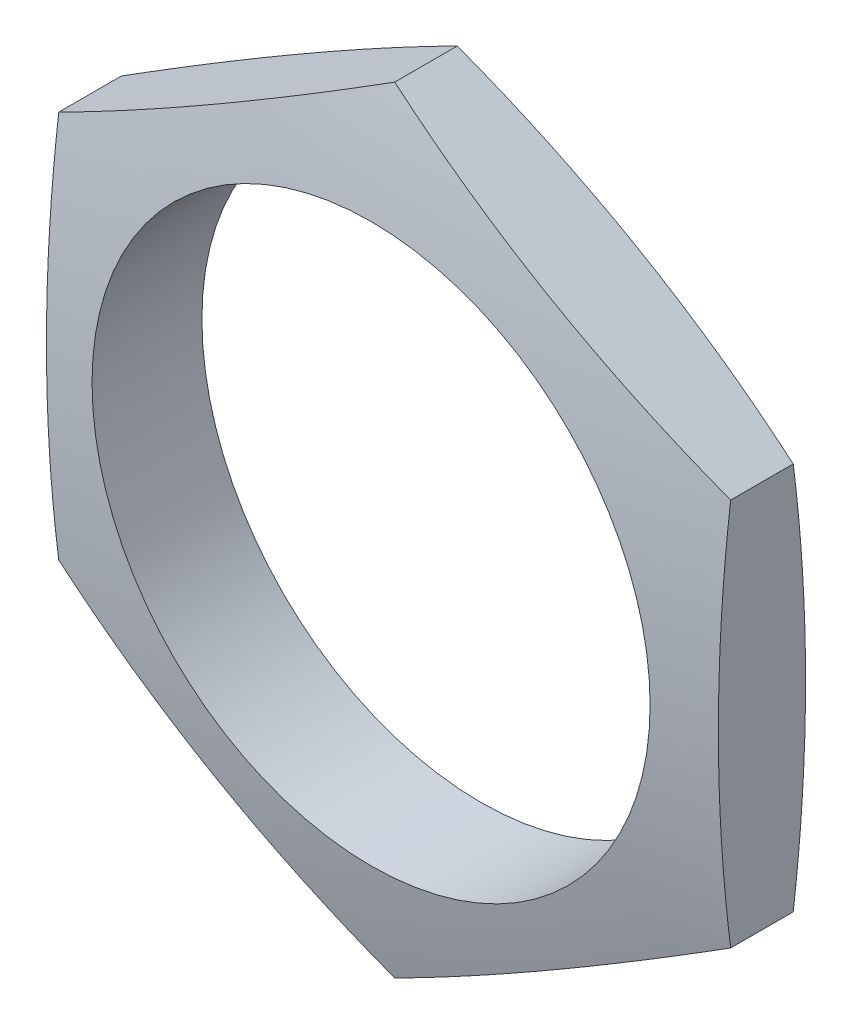
ISO-10303-21;
HEADER;
FILE_DESCRIPTION(('STEP AP214'),'2;1');
FILE_NAME('part.step','',(''),(''),'','','');
FILE_SCHEMA(('AUTOMOTIVE_DESIGN { 1 0 10303 214 1 1 1 1 }'));
ENDSEC;
DATA;
#1=APPLICATION_CONTEXT('core data for automotive mechanical design processes');
#2=APPLICATION_PROTOCOL_DEFINITION('international standard','automotive_design',2000,#1);
#3=PRODUCT_CONTEXT('',#1,'mechanical');
#4=PRODUCT('Part','Part','',(#3));
#5=PRODUCT_RELATED_PRODUCT_CATEGORY('part','',(#4));
#6=PRODUCT_DEFINITION_FORMATION('','',#4);
#7=PRODUCT_DEFINITION_CONTEXT('part definition',#1,'design');
#8=PRODUCT_DEFINITION('design','',#6,#7);
#9=PRODUCT_DEFINITION_SHAPE('','',#8);
#10=(LENGTH_UNIT() NAMED_UNIT(*) SI_UNIT(.MILLI.,.METRE.));
#11=(NAMED_UNIT(*) PLANE_ANGLE_UNIT() SI_UNIT($,.RADIAN.));
#12=(NAMED_UNIT(*) SI_UNIT($,.STERADIAN.) SOLID_ANGLE_UNIT());
#13=UNCERTAINTY_MEASURE_WITH_UNIT(LENGTH_MEASURE(1.E-05),#10,'distance_accuracy_value','');
#14=(GEOMETRIC_REPRESENTATION_CONTEXT(3) GLOBAL_UNCERTAINTY_ASSIGNED_CONTEXT((#13)) GLOBAL_UNIT_ASSIGNED_CONTEXT((#10,
#11,#12)) REPRESENTATION_CONTEXT('',''));
#15=CARTESIAN_POINT('',(0.,0.,0.));
#16=DIRECTION('',(0.,0.,1.));
#17=DIRECTION('',(1.,0.,0.));
#18=AXIS2_PLACEMENT_3D('',#15,#16,#17);
#19=CARTESIAN_POINT('',(6.92820323027546,4.00000000000008,2.8));
#20=DIRECTION('',(-0.499999999999995,-0.866025403784442,0.));
#21=DIRECTION('',(0.866025403784442,-0.499999999999995,0.));
#22=AXIS2_PLACEMENT_3D('',#19,#20,#21);
#23=PLANE('',#22);
#24=CARTESIAN_POINT('',(3.46410161513783,5.99999999999999,32.1649899582307));
#25=DIRECTION('',(-0.499999999999995,-0.866025403784442,0.));
#26=DIRECTION('',(0.866025403784442,-0.499999999999995,0.));
#27=AXIS2_PLACEMENT_3D('',#24,#25,#26);
#28=CIRCLE('',#27,31.6636475948852);
#29=CARTESIAN_POINT('',(1.63253663979982E-11,8.,0.755014170066153));
#30=VERTEX_POINT('',#29);
#31=CARTESIAN_POINT('',(6.92820323027546,4.00000000000008,0.755014170066154));
#32=VERTEX_POINT('',#31);
#33=EDGE_CURVE('E50',#30,#32,#28,.T.);
#34=ORIENTED_EDGE('',*,*,#33,.F.);
#35=DIRECTION('',(0.,0.,-1.));
#36=VECTOR('',#35,1.);
#37=CARTESIAN_POINT('',(0.,8.,2.8));
#38=LINE('',#37,#36);
#39=CARTESIAN_POINT('',(-3.50178666987978E-13,7.9999999999998,2.04498582993385));
#40=VERTEX_POINT('',#39);
#41=EDGE_CURVE('E11',#40,#30,#38,.T.);
#42=ORIENTED_EDGE('',*,*,#41,.F.);
#43=CARTESIAN_POINT('',(3.46410161513783,5.99999999999999,-29.3649899582307));
#44=DIRECTION('',(-0.499999999999995,-0.866025403784442,0.));
#45=DIRECTION('',(0.866025403784442,-0.499999999999995,0.));
#46=AXIS2_PLACEMENT_3D('',#43,#44,#45);
#47=CIRCLE('',#46,31.6636475948852);
#48=CARTESIAN_POINT('',(6.92820323027546,3.99999999999977,2.04498582993385));
#49=VERTEX_POINT('',#48);
#50=EDGE_CURVE('E125',#49,#40,#47,.T.);
#51=ORIENTED_EDGE('',*,*,#50,.F.);
#52=DIRECTION('',(0.,0.,-1.));
#53=VECTOR('',#52,1.);
#54=CARTESIAN_POINT('',(6.92820323027546,4.00000000000008,2.8));
#55=LINE('',#54,#53);
#56=EDGE_CURVE('E127',#49,#32,#55,.T.);
#57=ORIENTED_EDGE('',*,*,#56,.T.);
#58=EDGE_LOOP('',(#34,#42,#51,#57));
#59=FACE_BOUND('',#58,.T.);
#60=ADVANCED_FACE('F34',(#59),#23,.F.);
#61=CARTESIAN_POINT('',(0.,8.,2.8));
#62=DIRECTION('',(0.500000000000001,-0.866025403784438,0.));
#63=DIRECTION('',(0.866025403784438,0.500000000000001,0.));
#64=AXIS2_PLACEMENT_3D('',#61,#62,#63);
#65=PLANE('',#64);
#66=CARTESIAN_POINT('',(-3.46410161513785,5.99999999999994,32.1649899582307));
#67=DIRECTION('',(0.500000000000001,-0.866025403784438,0.));
#68=DIRECTION('',(0.866025403784438,0.500000000000001,0.));
#69=AXIS2_PLACEMENT_3D('',#66,#67,#68);
#70=CIRCLE('',#69,31.6636475948852);
#71=CARTESIAN_POINT('',(-6.92820323027859,3.99999999999467,0.755014170066153));
#72=VERTEX_POINT('',#71);
#73=EDGE_CURVE('E89',#72,#30,#70,.T.);
#74=ORIENTED_EDGE('',*,*,#73,.F.);
#75=DIRECTION('',(0.,0.,-1.));
#76=VECTOR('',#75,1.);
#77=CARTESIAN_POINT('',(-6.92820323027552,3.99999999999998,2.8));
#78=LINE('',#77,#76);
#79=CARTESIAN_POINT('',(-6.92820323027552,3.99999999999968,2.04498582993385));
#80=VERTEX_POINT('',#79);
#81=EDGE_CURVE('E42',#80,#72,#78,.T.);
#82=ORIENTED_EDGE('',*,*,#81,.F.);
#83=CARTESIAN_POINT('',(-3.46410161513785,5.99999999999994,-29.3649899582307));
#84=DIRECTION('',(0.500000000000001,-0.866025403784438,0.));
#85=DIRECTION('',(0.866025403784438,0.500000000000001,0.));
#86=AXIS2_PLACEMENT_3D('',#83,#84,#85);
#87=CIRCLE('',#86,31.6636475948852);
#88=EDGE_CURVE('E123',#40,#80,#87,.T.);
#89=ORIENTED_EDGE('',*,*,#88,.F.);
#90=ORIENTED_EDGE('',*,*,#41,.T.);
#91=EDGE_LOOP('',(#74,#82,#89,#90));
#92=FACE_BOUND('',#91,.T.);
#93=ADVANCED_FACE('F99',(#92),#65,.F.);
#94=CARTESIAN_POINT('',(-6.92820323027552,3.99999999999998,2.8));
#95=DIRECTION('',(1.,0.,0.));
#96=DIRECTION('',(0.,1.,0.));
#97=AXIS2_PLACEMENT_3D('',#94,#95,#96);
#98=PLANE('',#97);
#99=CARTESIAN_POINT('',(-6.92820323027551,-2.40010106338907E-13,32.1649899582307));
#100=DIRECTION('',(1.,0.,0.));
#101=DIRECTION('',(0.,1.,0.));
#102=AXIS2_PLACEMENT_3D('',#99,#100,#101);
#103=CIRCLE('',#102,31.6636475948852);
#104=CARTESIAN_POINT('',(-6.92820323028365,-3.9999999999859,0.755014170066153));
#105=VERTEX_POINT('',#104);
#106=EDGE_CURVE('E86',#105,#72,#103,.T.);
#107=ORIENTED_EDGE('',*,*,#106,.F.);
#108=DIRECTION('',(0.,0.,-1.));
#109=VECTOR('',#108,1.);
#110=CARTESIAN_POINT('',(-6.92820323027549,-4.00000000000003,2.8));
#111=LINE('',#110,#109);
#112=CARTESIAN_POINT('',(-6.92820323027541,-4.00000000000008,2.04498582993385));
#113=VERTEX_POINT('',#112);
#114=EDGE_CURVE('E106',#113,#105,#111,.T.);
#115=ORIENTED_EDGE('',*,*,#114,.F.);
#116=CARTESIAN_POINT('',(-6.92820323027551,-2.40010106338907E-13,-29.3649899582307));
#117=DIRECTION('',(1.,0.,0.));
#118=DIRECTION('',(0.,1.,0.));
#119=AXIS2_PLACEMENT_3D('',#116,#117,#118);
#120=CIRCLE('',#119,31.6636475948852);
#121=EDGE_CURVE('E105',#80,#113,#120,.T.);
#122=ORIENTED_EDGE('',*,*,#121,.F.);
#123=ORIENTED_EDGE('',*,*,#81,.T.);
#124=EDGE_LOOP('',(#107,#115,#122,#123));
#125=FACE_BOUND('',#124,.T.);
#126=ADVANCED_FACE('F104',(#125),#98,.F.);
#127=CARTESIAN_POINT('',(-6.92820323027549,-4.00000000000003,2.8));
#128=DIRECTION('',(0.499999999999995,0.866025403784442,0.));
#129=DIRECTION('',(-0.866025403784442,0.499999999999995,0.));
#130=AXIS2_PLACEMENT_3D('',#127,#128,#129);
#131=PLANE('',#130);
#132=CARTESIAN_POINT('',(-3.46410161513762,-6.00000000000007,32.1649899582307));
#133=DIRECTION('',(0.499999999999995,0.866025403784442,0.));
#134=DIRECTION('',(-0.866025403784442,0.499999999999995,0.));
#135=AXIS2_PLACEMENT_3D('',#132,#133,#134);
#136=CIRCLE('',#135,31.6636475948853);
#137=CARTESIAN_POINT('',(-1.62718866163713E-11,-8.,0.755014170066153));
#138=VERTEX_POINT('',#137);
#139=EDGE_CURVE('E91',#138,#105,#136,.T.);
#140=ORIENTED_EDGE('',*,*,#139,.F.);
#141=DIRECTION('',(0.,0.,-1.));
#142=VECTOR('',#141,1.);
#143=CARTESIAN_POINT('',(0.,-8.,2.8));
#144=LINE('',#143,#142);
#145=CARTESIAN_POINT('',(0.,-8.00000000000001,2.04498582993385));
#146=VERTEX_POINT('',#145);
#147=EDGE_CURVE('E108',#146,#138,#144,.T.);
#148=ORIENTED_EDGE('',*,*,#147,.F.);
#149=CARTESIAN_POINT('',(-3.46410161513762,-6.00000000000007,-29.3649899582307));
#150=DIRECTION('',(0.499999999999995,0.866025403784442,0.));
#151=DIRECTION('',(-0.866025403784442,0.499999999999995,0.));
#152=AXIS2_PLACEMENT_3D('',#149,#150,#151);
#153=CIRCLE('',#152,31.6636475948853);
#154=EDGE_CURVE('E120',#113,#146,#153,.T.);
#155=ORIENTED_EDGE('',*,*,#154,.F.);
#156=ORIENTED_EDGE('',*,*,#114,.T.);
#157=EDGE_LOOP('',(#140,#148,#155,#156));
#158=FACE_BOUND('',#157,.T.);
#159=ADVANCED_FACE('F141',(#158),#131,.F.);
#160=CARTESIAN_POINT('',(0.,-8.,2.8));
#161=DIRECTION('',(-0.500000000000007,0.866025403784435,0.));
#162=DIRECTION('',(-0.866025403784435,-0.500000000000007,0.));
#163=AXIS2_PLACEMENT_3D('',#160,#161,#162);
#164=PLANE('',#163);
#165=CARTESIAN_POINT('',(3.46410161513771,-6.00000000000002,32.1649899582307));
#166=DIRECTION('',(-0.500000000000007,0.866025403784435,0.));
#167=DIRECTION('',(-0.866025403784435,-0.500000000000007,0.));
#168=AXIS2_PLACEMENT_3D('',#165,#166,#167);
#169=CIRCLE('',#168,31.6636475948853);
#170=CARTESIAN_POINT('',(6.92820323027555,-3.99999999999993,0.755014170066153));
#171=VERTEX_POINT('',#170);
#172=EDGE_CURVE('E138',#171,#138,#169,.T.);
#173=ORIENTED_EDGE('',*,*,#172,.F.);
#174=DIRECTION('',(0.,0.,-1.));
#175=VECTOR('',#174,1.);
#176=CARTESIAN_POINT('',(6.92820323027555,-3.99999999999994,2.8));
#177=LINE('',#176,#175);
#178=CARTESIAN_POINT('',(6.92820323027555,-3.99999999999994,2.04498582993383));
#179=VERTEX_POINT('',#178);
#180=EDGE_CURVE('E130',#179,#171,#177,.T.);
#181=ORIENTED_EDGE('',*,*,#180,.F.);
#182=CARTESIAN_POINT('',(3.46410161513771,-6.00000000000002,-29.3649899582307));
#183=DIRECTION('',(-0.500000000000007,0.866025403784435,0.));
#184=DIRECTION('',(-0.866025403784435,-0.500000000000007,0.));
#185=AXIS2_PLACEMENT_3D('',#182,#183,#184);
#186=CIRCLE('',#185,31.6636475948853);
#187=EDGE_CURVE('E58',#146,#179,#186,.T.);
#188=ORIENTED_EDGE('',*,*,#187,.F.);
#189=ORIENTED_EDGE('',*,*,#147,.T.);
#190=EDGE_LOOP('',(#173,#181,#188,#189));
#191=FACE_BOUND('',#190,.T.);
#192=ADVANCED_FACE('F136',(#191),#164,.F.);
#193=CARTESIAN_POINT('',(6.92820323027555,-3.99999999999994,2.8));
#194=DIRECTION('',(-1.,0.,0.));
#195=DIRECTION('',(0.,-1.,0.));
#196=AXIS2_PLACEMENT_3D('',#193,#194,#195);
#197=PLANE('',#196);
#198=CARTESIAN_POINT('',(6.92820323027551,-1.43861972019729E-13,32.1649899582307));
#199=DIRECTION('',(-1.,0.,0.));
#200=DIRECTION('',(0.,-1.,0.));
#201=AXIS2_PLACEMENT_3D('',#198,#199,#200);
#202=CIRCLE('',#201,31.6636475948852);
#203=EDGE_CURVE('E143',#32,#171,#202,.T.);
#204=ORIENTED_EDGE('',*,*,#203,.F.);
#205=ORIENTED_EDGE('',*,*,#56,.F.);
#206=CARTESIAN_POINT('',(6.92820323027551,-1.43861972019729E-13,-29.3649899582307));
#207=DIRECTION('',(-1.,0.,0.));
#208=DIRECTION('',(0.,-1.,0.));
#209=AXIS2_PLACEMENT_3D('',#206,#207,#208);
#210=CIRCLE('',#209,31.6636475948852);
#211=EDGE_CURVE('E113',#179,#49,#210,.T.);
#212=ORIENTED_EDGE('',*,*,#211,.F.);
#213=ORIENTED_EDGE('',*,*,#180,.T.);
#214=EDGE_LOOP('',(#204,#205,#212,#213));
#215=FACE_BOUND('',#214,.T.);
#216=ADVANCED_FACE('F153',(#215),#197,.F.);
#217=CARTESIAN_POINT('',(0.,0.,2.8));
#218=DIRECTION('',(0.,0.,1.));
#219=DIRECTION('',(1.,0.,0.));
#220=AXIS2_PLACEMENT_3D('',#217,#218,#219);
#221=CYLINDRICAL_SURFACE('',#220,5.75436999999999);
#222=CARTESIAN_POINT('',(0.,0.,2.53287525115565));
#223=DIRECTION('',(0.,0.,-1.));
#224=DIRECTION('',(-1.,0.,0.));
#225=AXIS2_PLACEMENT_3D('',#222,#223,#224);
#226=CIRCLE('',#225,5.75436999999999);
#227=CARTESIAN_POINT('',(-5.75436999999999,0.,2.53287525115565));
#228=VERTEX_POINT('',#227);
#229=EDGE_CURVE('E111',#228,#228,#226,.T.);
#230=ORIENTED_EDGE('',*,*,#229,.F.);
#231=EDGE_LOOP('',(#230));
#232=FACE_BOUND('',#231,.T.);
#233=CARTESIAN_POINT('',(0.,0.,0.267124748844348));
#234=DIRECTION('',(0.,0.,1.));
#235=DIRECTION('',(1.,0.,0.));
#236=AXIS2_PLACEMENT_3D('',#233,#234,#235);
#237=CIRCLE('',#236,5.75436999999999);
#238=CARTESIAN_POINT('',(5.75436999999999,0.,0.267124748844348));
#239=VERTEX_POINT('',#238);
#240=EDGE_CURVE('E37',#239,#239,#237,.T.);
#241=ORIENTED_EDGE('',*,*,#240,.F.);
#242=EDGE_LOOP('',(#241));
#243=FACE_BOUND('',#242,.T.);
#244=ADVANCED_FACE('F150',(#232,#243),#221,.F.);
#245=CARTESIAN_POINT('',(0.,-2.15973072759112E-13,-29.3649899582307));
#246=DIRECTION('',(0.,0.,-1.));
#247=DIRECTION('',(0.,-1.,0.));
#248=AXIS2_PLACEMENT_3D('',#245,#246,#247);
#249=SPHERICAL_SURFACE('',#248,32.4127533389726);
#250=ORIENTED_EDGE('',*,*,#229,.T.);
#251=EDGE_LOOP('',(#250));
#252=FACE_BOUND('',#251,.T.);
#253=ORIENTED_EDGE('',*,*,#50,.T.);
#254=ORIENTED_EDGE('',*,*,#88,.T.);
#255=ORIENTED_EDGE('',*,*,#121,.T.);
#256=ORIENTED_EDGE('',*,*,#154,.T.);
#257=ORIENTED_EDGE('',*,*,#187,.T.);
#258=ORIENTED_EDGE('',*,*,#211,.T.);
#259=EDGE_LOOP('',(#253,#254,#255,#256,#257,#258));
#260=FACE_BOUND('',#259,.T.);
#261=ADVANCED_FACE('F152',(#252,#260),#249,.T.);
#262=CARTESIAN_POINT('',(0.,-2.15973072759112E-13,32.1649899582307));
#263=DIRECTION('',(0.,0.,-1.));
#264=DIRECTION('',(0.,-1.,0.));
#265=AXIS2_PLACEMENT_3D('',#262,#263,#264);
#266=SPHERICAL_SURFACE('',#265,32.4127533389726);
#267=ORIENTED_EDGE('',*,*,#240,.T.);
#268=EDGE_LOOP('',(#267));
#269=FACE_BOUND('',#268,.T.);
#270=ORIENTED_EDGE('',*,*,#33,.T.);
#271=ORIENTED_EDGE('',*,*,#203,.T.);
#272=ORIENTED_EDGE('',*,*,#172,.T.);
#273=ORIENTED_EDGE('',*,*,#139,.T.);
#274=ORIENTED_EDGE('',*,*,#106,.T.);
#275=ORIENTED_EDGE('',*,*,#73,.T.);
#276=EDGE_LOOP('',(#270,#271,#272,#273,#274,#275));
#277=FACE_BOUND('',#276,.T.);
#278=ADVANCED_FACE('F88',(#269,#277),#266,.T.);
#279=CLOSED_SHELL('',(#60,#93,#126,#159,#192,#216,#244,#261,#278));
#280=MANIFOLD_SOLID_BREP('B2',#279);
#281=ADVANCED_BREP_SHAPE_REPRESENTATION('',(#18,#280),#14);
#282=SHAPE_DEFINITION_REPRESENTATION(#9,#281);
ENDSEC;
END-ISO-10303-21;
